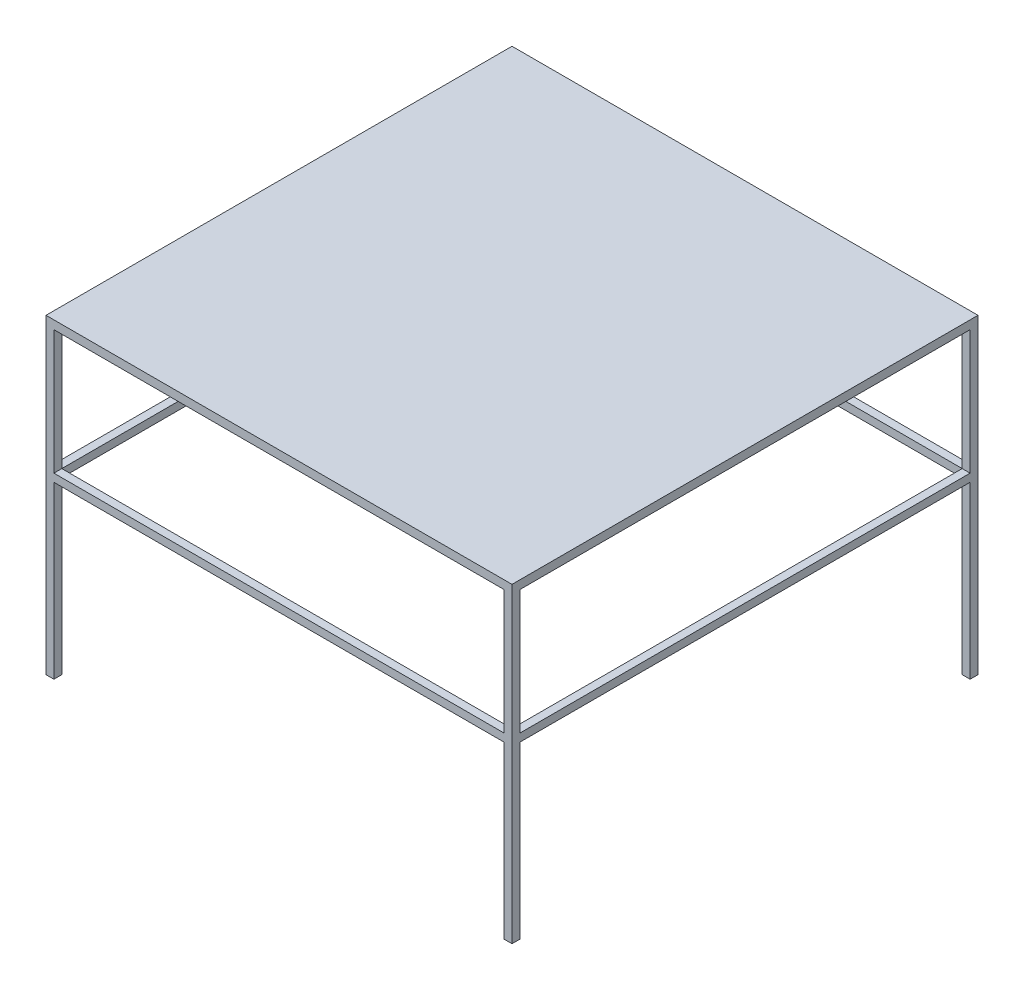
ISO-10303-21;
HEADER;
FILE_DESCRIPTION(('STEP AP214'),'2;1');
FILE_NAME('part.step','',(''),(''),'','','');
FILE_SCHEMA(('AUTOMOTIVE_DESIGN { 1 0 10303 214 1 1 1 1 }'));
ENDSEC;
DATA;
#1=APPLICATION_CONTEXT('core data for automotive mechanical design processes');
#2=APPLICATION_PROTOCOL_DEFINITION('international standard','automotive_design',2000,#1);
#3=PRODUCT_CONTEXT('',#1,'mechanical');
#4=PRODUCT('Part','Part','',(#3));
#5=PRODUCT_RELATED_PRODUCT_CATEGORY('part','',(#4));
#6=PRODUCT_DEFINITION_FORMATION('','',#4);
#7=PRODUCT_DEFINITION_CONTEXT('part definition',#1,'design');
#8=PRODUCT_DEFINITION('design','',#6,#7);
#9=PRODUCT_DEFINITION_SHAPE('','',#8);
#10=(LENGTH_UNIT() NAMED_UNIT(*) SI_UNIT(.MILLI.,.METRE.));
#11=(NAMED_UNIT(*) PLANE_ANGLE_UNIT() SI_UNIT($,.RADIAN.));
#12=(NAMED_UNIT(*) SI_UNIT($,.STERADIAN.) SOLID_ANGLE_UNIT());
#13=UNCERTAINTY_MEASURE_WITH_UNIT(LENGTH_MEASURE(1.E-05),#10,'distance_accuracy_value','');
#14=(GEOMETRIC_REPRESENTATION_CONTEXT(3) GLOBAL_UNCERTAINTY_ASSIGNED_CONTEXT((#13)) GLOBAL_UNIT_ASSIGNED_CONTEXT((#10,
#11,#12)) REPRESENTATION_CONTEXT('',''));
#15=CARTESIAN_POINT('',(0.,0.,0.));
#16=DIRECTION('',(0.,0.,1.));
#17=DIRECTION('',(1.,0.,0.));
#18=AXIS2_PLACEMENT_3D('',#15,#16,#17);
#19=CARTESIAN_POINT('',(0.,1000.,25.4));
#20=DIRECTION('',(0.,0.,-1.));
#21=DIRECTION('',(-1.,0.,0.));
#22=AXIS2_PLACEMENT_3D('',#19,#20,#21);
#23=PLANE('',#22);
#24=DIRECTION('',(0.,-1.,0.));
#25=VECTOR('',#24,1.);
#26=CARTESIAN_POINT('',(0.,1000.,25.4));
#27=LINE('',#26,#25);
#28=CARTESIAN_POINT('',(0.,974.6,25.4));
#29=VERTEX_POINT('',#28);
#30=CARTESIAN_POINT('',(0.,574.6,25.4));
#31=VERTEX_POINT('',#30);
#32=EDGE_CURVE('E11',#29,#31,#27,.T.);
#33=ORIENTED_EDGE('',*,*,#32,.T.);
#34=DIRECTION('',(-1.,0.,0.));
#35=VECTOR('',#34,1.);
#36=CARTESIAN_POINT('',(25.4,574.6,25.4000000000002));
#37=LINE('',#36,#35);
#38=CARTESIAN_POINT('',(25.4,574.6,25.4));
#39=VERTEX_POINT('',#38);
#40=EDGE_CURVE('E277',#39,#31,#37,.T.);
#41=ORIENTED_EDGE('',*,*,#40,.F.);
#42=DIRECTION('',(0.,-1.,0.));
#43=VECTOR('',#42,1.);
#44=CARTESIAN_POINT('',(25.4,1000.,25.4));
#45=LINE('',#44,#43);
#46=CARTESIAN_POINT('',(25.4,974.6,25.4));
#47=VERTEX_POINT('',#46);
#48=EDGE_CURVE('E512',#47,#39,#45,.T.);
#49=ORIENTED_EDGE('',*,*,#48,.F.);
#50=DIRECTION('',(-1.,0.,0.));
#51=VECTOR('',#50,1.);
#52=CARTESIAN_POINT('',(25.4,974.6,25.4));
#53=LINE('',#52,#51);
#54=EDGE_CURVE('E299',#47,#29,#53,.T.);
#55=ORIENTED_EDGE('',*,*,#54,.T.);
#56=EDGE_LOOP('',(#33,#41,#49,#55));
#57=FACE_BOUND('',#56,.T.);
#58=ADVANCED_FACE('F33',(#57),#23,.F.);
#59=DIRECTION('',(0.,-1.,0.));
#60=VECTOR('',#59,1.);
#61=CARTESIAN_POINT('',(25.4,574.6,25.4000000000002));
#62=LINE('',#61,#60);
#63=CARTESIAN_POINT('',(25.4,549.2,25.4));
#64=VERTEX_POINT('',#63);
#65=EDGE_CURVE('E261',#39,#64,#62,.T.);
#66=ORIENTED_EDGE('',*,*,#65,.T.);
#67=DIRECTION('',(-1.,0.,0.));
#68=VECTOR('',#67,1.);
#69=CARTESIAN_POINT('',(1474.6,549.2,25.4));
#70=LINE('',#69,#68);
#71=CARTESIAN_POINT('',(1474.6,549.2,25.4));
#72=VERTEX_POINT('',#71);
#73=EDGE_CURVE('E308',#72,#64,#70,.T.);
#74=ORIENTED_EDGE('',*,*,#73,.F.);
#75=DIRECTION('',(0.,-1.,0.));
#76=VECTOR('',#75,1.);
#77=CARTESIAN_POINT('',(1474.6,574.6,25.4));
#78=LINE('',#77,#76);
#79=CARTESIAN_POINT('',(1474.6,574.6,25.4));
#80=VERTEX_POINT('',#79);
#81=EDGE_CURVE('E306',#80,#72,#78,.T.);
#82=ORIENTED_EDGE('',*,*,#81,.F.);
#83=DIRECTION('',(1.,0.,0.));
#84=VECTOR('',#83,1.);
#85=CARTESIAN_POINT('',(1474.6,574.6,25.4));
#86=LINE('',#85,#84);
#87=EDGE_CURVE('E312',#39,#80,#86,.T.);
#88=ORIENTED_EDGE('',*,*,#87,.F.);
#89=EDGE_LOOP('',(#66,#74,#82,#88));
#90=FACE_BOUND('',#89,.T.);
#91=ADVANCED_FACE('F571',(#90),#23,.F.);
#92=CARTESIAN_POINT('',(0.,1000.,1474.6));
#93=DIRECTION('',(0.,0.,1.));
#94=DIRECTION('',(1.,0.,0.));
#95=AXIS2_PLACEMENT_3D('',#92,#93,#94);
#96=PLANE('',#95);
#97=DIRECTION('',(0.,-1.,0.));
#98=VECTOR('',#97,1.);
#99=CARTESIAN_POINT('',(25.4,1000.,1474.6));
#100=LINE('',#99,#98);
#101=CARTESIAN_POINT('',(25.4000000000002,974.6,1474.6));
#102=VERTEX_POINT('',#101);
#103=CARTESIAN_POINT('',(25.4000000000002,574.6,1474.6));
#104=VERTEX_POINT('',#103);
#105=EDGE_CURVE('E435',#102,#104,#100,.T.);
#106=ORIENTED_EDGE('',*,*,#105,.T.);
#107=DIRECTION('',(-1.,0.,0.));
#108=VECTOR('',#107,1.);
#109=CARTESIAN_POINT('',(25.4000000000002,574.6,1474.6));
#110=LINE('',#109,#108);
#111=CARTESIAN_POINT('',(1.80586417002269E-13,574.6,1474.6));
#112=VERTEX_POINT('',#111);
#113=EDGE_CURVE('E280',#104,#112,#110,.T.);
#114=ORIENTED_EDGE('',*,*,#113,.T.);
#115=DIRECTION('',(0.,-1.,0.));
#116=VECTOR('',#115,1.);
#117=CARTESIAN_POINT('',(0.,1000.,1474.6));
#118=LINE('',#117,#116);
#119=CARTESIAN_POINT('',(0.,974.6,1474.6));
#120=VERTEX_POINT('',#119);
#121=EDGE_CURVE('E431',#120,#112,#118,.T.);
#122=ORIENTED_EDGE('',*,*,#121,.F.);
#123=DIRECTION('',(-1.,0.,0.));
#124=VECTOR('',#123,1.);
#125=CARTESIAN_POINT('',(25.4000000000002,974.6,1474.6));
#126=LINE('',#125,#124);
#127=EDGE_CURVE('E301',#102,#120,#126,.T.);
#128=ORIENTED_EDGE('',*,*,#127,.F.);
#129=EDGE_LOOP('',(#106,#114,#122,#128));
#130=FACE_BOUND('',#129,.T.);
#131=ADVANCED_FACE('F581',(#130),#96,.F.);
#132=DIRECTION('',(0.,1.,0.));
#133=VECTOR('',#132,1.);
#134=CARTESIAN_POINT('',(25.4000000000002,574.6,1474.6));
#135=LINE('',#134,#133);
#136=CARTESIAN_POINT('',(25.4000000000002,549.2,1474.6));
#137=VERTEX_POINT('',#136);
#138=EDGE_CURVE('E267',#137,#104,#135,.T.);
#139=ORIENTED_EDGE('',*,*,#138,.T.);
#140=DIRECTION('',(1.,0.,0.));
#141=VECTOR('',#140,1.);
#142=CARTESIAN_POINT('',(25.4,574.6,1474.6));
#143=LINE('',#142,#141);
#144=CARTESIAN_POINT('',(1474.6,574.6,1474.6));
#145=VERTEX_POINT('',#144);
#146=EDGE_CURVE('E356',#104,#145,#143,.T.);
#147=ORIENTED_EDGE('',*,*,#146,.T.);
#148=DIRECTION('',(0.,-1.,0.));
#149=VECTOR('',#148,1.);
#150=CARTESIAN_POINT('',(1474.6,574.6,1474.6));
#151=LINE('',#150,#149);
#152=CARTESIAN_POINT('',(1474.6,549.2,1474.6));
#153=VERTEX_POINT('',#152);
#154=EDGE_CURVE('E331',#145,#153,#151,.T.);
#155=ORIENTED_EDGE('',*,*,#154,.T.);
#156=DIRECTION('',(-1.,0.,0.));
#157=VECTOR('',#156,1.);
#158=CARTESIAN_POINT('',(25.4,549.2,1474.6));
#159=LINE('',#158,#157);
#160=EDGE_CURVE('E359',#153,#137,#159,.T.);
#161=ORIENTED_EDGE('',*,*,#160,.T.);
#162=EDGE_LOOP('',(#139,#147,#155,#161));
#163=FACE_BOUND('',#162,.T.);
#164=ADVANCED_FACE('F641',(#163),#96,.F.);
#165=DIRECTION('',(0.,-1.,0.));
#166=VECTOR('',#165,1.);
#167=CARTESIAN_POINT('',(25.4,1000.,25.4));
#168=LINE('',#167,#166);
#169=CARTESIAN_POINT('',(25.4,1000.,25.4));
#170=VERTEX_POINT('',#169);
#171=EDGE_CURVE('E287',#170,#47,#168,.T.);
#172=ORIENTED_EDGE('',*,*,#171,.T.);
#173=DIRECTION('',(-1.,0.,0.));
#174=VECTOR('',#173,1.);
#175=CARTESIAN_POINT('',(1474.6,974.6,25.4));
#176=LINE('',#175,#174);
#177=CARTESIAN_POINT('',(1474.6,974.6,25.4));
#178=VERTEX_POINT('',#177);
#179=EDGE_CURVE('E482',#178,#47,#176,.T.);
#180=ORIENTED_EDGE('',*,*,#179,.F.);
#181=DIRECTION('',(0.,-1.,0.));
#182=VECTOR('',#181,1.);
#183=CARTESIAN_POINT('',(1474.6,1000.,25.4));
#184=LINE('',#183,#182);
#185=CARTESIAN_POINT('',(1474.6,1000.,25.4));
#186=VERTEX_POINT('',#185);
#187=EDGE_CURVE('E479',#186,#178,#184,.T.);
#188=ORIENTED_EDGE('',*,*,#187,.F.);
#189=DIRECTION('',(1.,0.,0.));
#190=VECTOR('',#189,1.);
#191=CARTESIAN_POINT('',(0.,1000.,25.4));
#192=LINE('',#191,#190);
#193=EDGE_CURVE('E494',#170,#186,#192,.T.);
#194=ORIENTED_EDGE('',*,*,#193,.F.);
#195=EDGE_LOOP('',(#172,#180,#188,#194));
#196=FACE_BOUND('',#195,.T.);
#197=ADVANCED_FACE('F640',(#196),#23,.F.);
#198=DIRECTION('',(0.,1.,0.));
#199=VECTOR('',#198,1.);
#200=CARTESIAN_POINT('',(25.4000000000002,1000.,1474.6));
#201=LINE('',#200,#199);
#202=CARTESIAN_POINT('',(25.4000000000002,1000.,1474.6));
#203=VERTEX_POINT('',#202);
#204=EDGE_CURVE('E293',#102,#203,#201,.T.);
#205=ORIENTED_EDGE('',*,*,#204,.T.);
#206=DIRECTION('',(-1.,0.,0.));
#207=VECTOR('',#206,1.);
#208=CARTESIAN_POINT('',(0.,1000.,1474.6));
#209=LINE('',#208,#207);
#210=CARTESIAN_POINT('',(1474.6,1000.,1474.6));
#211=VERTEX_POINT('',#210);
#212=EDGE_CURVE('E414',#211,#203,#209,.T.);
#213=ORIENTED_EDGE('',*,*,#212,.F.);
#214=DIRECTION('',(0.,-1.,0.));
#215=VECTOR('',#214,1.);
#216=CARTESIAN_POINT('',(1474.6,1000.,1474.6));
#217=LINE('',#216,#215);
#218=CARTESIAN_POINT('',(1474.6,974.6,1474.6));
#219=VERTEX_POINT('',#218);
#220=EDGE_CURVE('E443',#211,#219,#217,.T.);
#221=ORIENTED_EDGE('',*,*,#220,.T.);
#222=DIRECTION('',(-1.,0.,0.));
#223=VECTOR('',#222,1.);
#224=CARTESIAN_POINT('',(25.4,974.6,1474.6));
#225=LINE('',#224,#223);
#226=EDGE_CURVE('E408',#219,#102,#225,.T.);
#227=ORIENTED_EDGE('',*,*,#226,.T.);
#228=EDGE_LOOP('',(#205,#213,#221,#227));
#229=FACE_BOUND('',#228,.T.);
#230=ADVANCED_FACE('F590',(#229),#96,.F.);
#231=CARTESIAN_POINT('',(25.4,1000.,0.));
#232=DIRECTION('',(-1.,0.,0.));
#233=DIRECTION('',(0.,0.,1.));
#234=AXIS2_PLACEMENT_3D('',#231,#232,#233);
#235=PLANE('',#234);
#236=ORIENTED_EDGE('',*,*,#48,.T.);
#237=DIRECTION('',(0.,0.,-1.));
#238=VECTOR('',#237,1.);
#239=CARTESIAN_POINT('',(25.4,574.6,25.4));
#240=LINE('',#239,#238);
#241=CARTESIAN_POINT('',(25.4,574.6,0.));
#242=VERTEX_POINT('',#241);
#243=EDGE_CURVE('E323',#39,#242,#240,.T.);
#244=ORIENTED_EDGE('',*,*,#243,.T.);
#245=DIRECTION('',(0.,-1.,0.));
#246=VECTOR('',#245,1.);
#247=CARTESIAN_POINT('',(25.4,1000.,0.));
#248=LINE('',#247,#246);
#249=CARTESIAN_POINT('',(25.4,974.6,0.));
#250=VERTEX_POINT('',#249);
#251=EDGE_CURVE('E509',#250,#242,#248,.T.);
#252=ORIENTED_EDGE('',*,*,#251,.F.);
#253=DIRECTION('',(0.,0.,-1.));
#254=VECTOR('',#253,1.);
#255=CARTESIAN_POINT('',(25.4,974.6,25.4));
#256=LINE('',#255,#254);
#257=EDGE_CURVE('E488',#47,#250,#256,.T.);
#258=ORIENTED_EDGE('',*,*,#257,.F.);
#259=EDGE_LOOP('',(#236,#244,#252,#258));
#260=FACE_BOUND('',#259,.T.);
#261=ADVANCED_FACE('F639',(#260),#235,.F.);
#262=CARTESIAN_POINT('',(1474.6,1000.,0.));
#263=DIRECTION('',(1.,0.,0.));
#264=DIRECTION('',(0.,0.,-1.));
#265=AXIS2_PLACEMENT_3D('',#262,#263,#264);
#266=PLANE('',#265);
#267=DIRECTION('',(0.,-1.,0.));
#268=VECTOR('',#267,1.);
#269=CARTESIAN_POINT('',(1474.6,1000.,0.));
#270=LINE('',#269,#268);
#271=CARTESIAN_POINT('',(1474.6,974.6,0.));
#272=VERTEX_POINT('',#271);
#273=CARTESIAN_POINT('',(1474.6,574.6,0.));
#274=VERTEX_POINT('',#273);
#275=EDGE_CURVE('E476',#272,#274,#270,.T.);
#276=ORIENTED_EDGE('',*,*,#275,.T.);
#277=DIRECTION('',(0.,0.,-1.));
#278=VECTOR('',#277,1.);
#279=CARTESIAN_POINT('',(1474.6,574.6,25.4));
#280=LINE('',#279,#278);
#281=EDGE_CURVE('E319',#80,#274,#280,.T.);
#282=ORIENTED_EDGE('',*,*,#281,.F.);
#283=DIRECTION('',(0.,-1.,0.));
#284=VECTOR('',#283,1.);
#285=CARTESIAN_POINT('',(1474.6,1000.,25.4));
#286=LINE('',#285,#284);
#287=EDGE_CURVE('E472',#178,#80,#286,.T.);
#288=ORIENTED_EDGE('',*,*,#287,.F.);
#289=DIRECTION('',(0.,0.,-1.));
#290=VECTOR('',#289,1.);
#291=CARTESIAN_POINT('',(1474.6,974.6,25.4));
#292=LINE('',#291,#290);
#293=EDGE_CURVE('E485',#178,#272,#292,.T.);
#294=ORIENTED_EDGE('',*,*,#293,.T.);
#295=EDGE_LOOP('',(#276,#282,#288,#294));
#296=FACE_BOUND('',#295,.T.);
#297=ADVANCED_FACE('F667',(#296),#266,.F.);
#298=ORIENTED_EDGE('',*,*,#81,.T.);
#299=DIRECTION('',(0.,0.,-1.));
#300=VECTOR('',#299,1.);
#301=CARTESIAN_POINT('',(1474.6,549.2,1474.6));
#302=LINE('',#301,#300);
#303=EDGE_CURVE('E333',#153,#72,#302,.T.);
#304=ORIENTED_EDGE('',*,*,#303,.F.);
#305=ORIENTED_EDGE('',*,*,#154,.F.);
#306=DIRECTION('',(0.,0.,1.));
#307=VECTOR('',#306,1.);
#308=CARTESIAN_POINT('',(1474.6,574.6,1474.6));
#309=LINE('',#308,#307);
#310=EDGE_CURVE('E337',#80,#145,#309,.T.);
#311=ORIENTED_EDGE('',*,*,#310,.F.);
#312=EDGE_LOOP('',(#298,#304,#305,#311));
#313=FACE_BOUND('',#312,.T.);
#314=ADVANCED_FACE('F610',(#313),#266,.F.);
#315=CARTESIAN_POINT('',(25.4,549.2,0.));
#316=VERTEX_POINT('',#315);
#317=CARTESIAN_POINT('',(25.4,0.,0.));
#318=VERTEX_POINT('',#317);
#319=EDGE_CURVE('E508',#316,#318,#248,.T.);
#320=ORIENTED_EDGE('',*,*,#319,.F.);
#321=DIRECTION('',(0.,0.,-1.));
#322=VECTOR('',#321,1.);
#323=CARTESIAN_POINT('',(25.4,549.2,25.4));
#324=LINE('',#323,#322);
#325=EDGE_CURVE('E326',#64,#316,#324,.T.);
#326=ORIENTED_EDGE('',*,*,#325,.F.);
#327=CARTESIAN_POINT('',(25.4,0.,25.4));
#328=VERTEX_POINT('',#327);
#329=EDGE_CURVE('E511',#64,#328,#45,.T.);
#330=ORIENTED_EDGE('',*,*,#329,.T.);
#331=DIRECTION('',(0.,0.,-1.));
#332=VECTOR('',#331,1.);
#333=CARTESIAN_POINT('',(25.4,0.,0.));
#334=LINE('',#333,#332);
#335=EDGE_CURVE('E503',#328,#318,#334,.T.);
#336=ORIENTED_EDGE('',*,*,#335,.T.);
#337=EDGE_LOOP('',(#320,#326,#330,#336));
#338=FACE_BOUND('',#337,.T.);
#339=ADVANCED_FACE('F522',(#338),#235,.F.);
#340=CARTESIAN_POINT('',(0.,1000.,0.));
#341=DIRECTION('',(1.,0.,0.));
#342=DIRECTION('',(0.,0.,-1.));
#343=AXIS2_PLACEMENT_3D('',#340,#341,#342);
#344=PLANE('',#343);
#345=CARTESIAN_POINT('',(0.,549.2,25.4000000000002));
#346=VERTEX_POINT('',#345);
#347=CARTESIAN_POINT('',(0.,0.,25.4));
#348=VERTEX_POINT('',#347);
#349=EDGE_CURVE('E41',#346,#348,#27,.T.);
#350=ORIENTED_EDGE('',*,*,#349,.F.);
#351=DIRECTION('',(0.,0.,1.));
#352=VECTOR('',#351,1.);
#353=CARTESIAN_POINT('',(0.,549.2,25.4000000000002));
#354=LINE('',#353,#352);
#355=CARTESIAN_POINT('',(0.,549.2,1474.6));
#356=VERTEX_POINT('',#355);
#357=EDGE_CURVE('E54',#346,#356,#354,.T.);
#358=ORIENTED_EDGE('',*,*,#357,.T.);
#359=CARTESIAN_POINT('',(0.,0.,1474.6));
#360=VERTEX_POINT('',#359);
#361=EDGE_CURVE('E430',#356,#360,#118,.T.);
#362=ORIENTED_EDGE('',*,*,#361,.T.);
#363=DIRECTION('',(0.,0.,1.));
#364=VECTOR('',#363,1.);
#365=CARTESIAN_POINT('',(0.,0.,1500.));
#366=LINE('',#365,#364);
#367=CARTESIAN_POINT('',(0.,0.,1500.));
#368=VERTEX_POINT('',#367);
#369=EDGE_CURVE('E418',#360,#368,#366,.T.);
#370=ORIENTED_EDGE('',*,*,#369,.T.);
#371=DIRECTION('',(0.,-1.,0.));
#372=VECTOR('',#371,1.);
#373=CARTESIAN_POINT('',(0.,1000.,1500.));
#374=LINE('',#373,#372);
#375=CARTESIAN_POINT('',(0.,1001.9,1500.));
#376=VERTEX_POINT('',#375);
#377=EDGE_CURVE('E417',#376,#368,#374,.T.);
#378=ORIENTED_EDGE('',*,*,#377,.F.);
#379=DIRECTION('',(0.,0.,1.));
#380=VECTOR('',#379,1.);
#381=CARTESIAN_POINT('',(0.,1001.9,0.));
#382=LINE('',#381,#380);
#383=CARTESIAN_POINT('',(0.,1001.9,0.));
#384=VERTEX_POINT('',#383);
#385=EDGE_CURVE('E251',#384,#376,#382,.T.);
#386=ORIENTED_EDGE('',*,*,#385,.F.);
#387=DIRECTION('',(0.,-1.,0.));
#388=VECTOR('',#387,1.);
#389=CARTESIAN_POINT('',(0.,1000.,0.));
#390=LINE('',#389,#388);
#391=CARTESIAN_POINT('',(0.,0.,0.));
#392=VERTEX_POINT('',#391);
#393=EDGE_CURVE('E247',#384,#392,#390,.T.);
#394=ORIENTED_EDGE('',*,*,#393,.T.);
#395=DIRECTION('',(0.,0.,1.));
#396=VECTOR('',#395,1.);
#397=CARTESIAN_POINT('',(0.,0.,0.));
#398=LINE('',#397,#396);
#399=EDGE_CURVE('E491',#392,#348,#398,.T.);
#400=ORIENTED_EDGE('',*,*,#399,.T.);
#401=EDGE_LOOP('',(#350,#358,#362,#370,#378,#386,#394,#400));
#402=FACE_BOUND('',#401,.T.);
#403=DIRECTION('',(0.,0.,-1.));
#404=VECTOR('',#403,1.);
#405=CARTESIAN_POINT('',(0.,574.6,25.4000000000002));
#406=LINE('',#405,#404);
#407=EDGE_CURVE('E264',#112,#31,#406,.T.);
#408=ORIENTED_EDGE('',*,*,#407,.T.);
#409=ORIENTED_EDGE('',*,*,#32,.F.);
#410=DIRECTION('',(0.,0.,1.));
#411=VECTOR('',#410,1.);
#412=CARTESIAN_POINT('',(0.,974.6,25.4));
#413=LINE('',#412,#411);
#414=EDGE_CURVE('E279',#29,#120,#413,.T.);
#415=ORIENTED_EDGE('',*,*,#414,.T.);
#416=ORIENTED_EDGE('',*,*,#121,.T.);
#417=EDGE_LOOP('',(#408,#409,#415,#416));
#418=FACE_BOUND('',#417,.T.);
#419=ADVANCED_FACE('F35',(#402,#418),#344,.F.);
#420=ORIENTED_EDGE('',*,*,#329,.F.);
#421=DIRECTION('',(-1.,0.,0.));
#422=VECTOR('',#421,1.);
#423=CARTESIAN_POINT('',(25.4,549.2,25.4000000000002));
#424=LINE('',#423,#422);
#425=EDGE_CURVE('E273',#64,#346,#424,.T.);
#426=ORIENTED_EDGE('',*,*,#425,.T.);
#427=ORIENTED_EDGE('',*,*,#349,.T.);
#428=DIRECTION('',(1.,0.,0.));
#429=VECTOR('',#428,1.);
#430=CARTESIAN_POINT('',(0.,0.,25.4));
#431=LINE('',#430,#429);
#432=EDGE_CURVE('E500',#348,#328,#431,.T.);
#433=ORIENTED_EDGE('',*,*,#432,.T.);
#434=EDGE_LOOP('',(#420,#426,#427,#433));
#435=FACE_BOUND('',#434,.T.);
#436=ADVANCED_FACE('F528',(#435),#23,.F.);
#437=CARTESIAN_POINT('',(0.,1000.,0.));
#438=DIRECTION('',(0.,0.,1.));
#439=DIRECTION('',(1.,0.,0.));
#440=AXIS2_PLACEMENT_3D('',#437,#438,#439);
#441=PLANE('',#440);
#442=ORIENTED_EDGE('',*,*,#251,.T.);
#443=DIRECTION('',(1.,0.,0.));
#444=VECTOR('',#443,1.);
#445=CARTESIAN_POINT('',(1474.6,574.6,0.));
#446=LINE('',#445,#444);
#447=EDGE_CURVE('E309',#242,#274,#446,.T.);
#448=ORIENTED_EDGE('',*,*,#447,.T.);
#449=ORIENTED_EDGE('',*,*,#275,.F.);
#450=DIRECTION('',(-1.,0.,0.));
#451=VECTOR('',#450,1.);
#452=CARTESIAN_POINT('',(1474.6,974.6,0.));
#453=LINE('',#452,#451);
#454=EDGE_CURVE('E478',#272,#250,#453,.T.);
#455=ORIENTED_EDGE('',*,*,#454,.T.);
#456=EDGE_LOOP('',(#442,#448,#449,#455));
#457=FACE_BOUND('',#456,.T.);
#458=DIRECTION('',(-1.,0.,0.));
#459=VECTOR('',#458,1.);
#460=CARTESIAN_POINT('',(0.,0.,0.));
#461=LINE('',#460,#459);
#462=EDGE_CURVE('E497',#318,#392,#461,.T.);
#463=ORIENTED_EDGE('',*,*,#462,.T.);
#464=ORIENTED_EDGE('',*,*,#393,.F.);
#465=DIRECTION('',(-1.,0.,0.));
#466=VECTOR('',#465,1.);
#467=CARTESIAN_POINT('',(1500.,1001.9,0.));
#468=LINE('',#467,#466);
#469=CARTESIAN_POINT('',(1500.,1001.9,0.));
#470=VERTEX_POINT('',#469);
#471=EDGE_CURVE('E244',#470,#384,#468,.T.);
#472=ORIENTED_EDGE('',*,*,#471,.F.);
#473=DIRECTION('',(0.,-1.,0.));
#474=VECTOR('',#473,1.);
#475=CARTESIAN_POINT('',(1500.,1000.,0.));
#476=LINE('',#475,#474);
#477=CARTESIAN_POINT('',(1500.,0.,0.));
#478=VERTEX_POINT('',#477);
#479=EDGE_CURVE('E229',#470,#478,#476,.T.);
#480=ORIENTED_EDGE('',*,*,#479,.T.);
#481=DIRECTION('',(-1.,0.,0.));
#482=VECTOR('',#481,1.);
#483=CARTESIAN_POINT('',(1500.,0.,0.));
#484=LINE('',#483,#482);
#485=CARTESIAN_POINT('',(1474.6,0.,0.));
#486=VERTEX_POINT('',#485);
#487=EDGE_CURVE('E455',#478,#486,#484,.T.);
#488=ORIENTED_EDGE('',*,*,#487,.T.);
#489=CARTESIAN_POINT('',(1474.6,549.2,0.));
#490=VERTEX_POINT('',#489);
#491=EDGE_CURVE('E475',#490,#486,#270,.T.);
#492=ORIENTED_EDGE('',*,*,#491,.F.);
#493=DIRECTION('',(-1.,0.,0.));
#494=VECTOR('',#493,1.);
#495=CARTESIAN_POINT('',(1474.6,549.2,0.));
#496=LINE('',#495,#494);
#497=EDGE_CURVE('E304',#490,#316,#496,.T.);
#498=ORIENTED_EDGE('',*,*,#497,.T.);
#499=ORIENTED_EDGE('',*,*,#319,.T.);
#500=EDGE_LOOP('',(#463,#464,#472,#480,#488,#492,#498,#499));
#501=FACE_BOUND('',#500,.T.);
#502=ADVANCED_FACE('F245',(#457,#501),#441,.F.);
#503=CARTESIAN_POINT('',(0.,0.,0.));
#504=DIRECTION('',(0.,1.,0.));
#505=DIRECTION('',(0.,0.,1.));
#506=AXIS2_PLACEMENT_3D('',#503,#504,#505);
#507=PLANE('',#506);
#508=ORIENTED_EDGE('',*,*,#399,.F.);
#509=ORIENTED_EDGE('',*,*,#462,.F.);
#510=ORIENTED_EDGE('',*,*,#335,.F.);
#511=ORIENTED_EDGE('',*,*,#432,.F.);
#512=EDGE_LOOP('',(#508,#509,#510,#511));
#513=FACE_BOUND('',#512,.T.);
#514=ADVANCED_FACE('F531',(#513),#507,.F.);
#515=CARTESIAN_POINT('',(1474.6,974.6,25.4));
#516=DIRECTION('',(0.,-1.,0.));
#517=DIRECTION('',(0.,0.,-1.));
#518=AXIS2_PLACEMENT_3D('',#515,#516,#517);
#519=PLANE('',#518);
#520=ORIENTED_EDGE('',*,*,#454,.F.);
#521=ORIENTED_EDGE('',*,*,#293,.F.);
#522=ORIENTED_EDGE('',*,*,#179,.T.);
#523=ORIENTED_EDGE('',*,*,#257,.T.);
#524=EDGE_LOOP('',(#520,#521,#522,#523));
#525=FACE_BOUND('',#524,.T.);
#526=ADVANCED_FACE('F664',(#525),#519,.T.);
#527=DIRECTION('',(0.,0.,1.));
#528=VECTOR('',#527,1.);
#529=CARTESIAN_POINT('',(1474.6,1000.,0.));
#530=LINE('',#529,#528);
#531=EDGE_CURVE('E241',#186,#211,#530,.T.);
#532=ORIENTED_EDGE('',*,*,#531,.F.);
#533=ORIENTED_EDGE('',*,*,#187,.T.);
#534=DIRECTION('',(0.,0.,-1.));
#535=VECTOR('',#534,1.);
#536=CARTESIAN_POINT('',(1474.6,974.6,1474.6));
#537=LINE('',#536,#535);
#538=EDGE_CURVE('E446',#219,#178,#537,.T.);
#539=ORIENTED_EDGE('',*,*,#538,.F.);
#540=ORIENTED_EDGE('',*,*,#220,.F.);
#541=EDGE_LOOP('',(#532,#533,#539,#540));
#542=FACE_BOUND('',#541,.T.);
#543=ADVANCED_FACE('F634',(#542),#266,.F.);
#544=CARTESIAN_POINT('',(1500.,1000.,25.4));
#545=DIRECTION('',(0.,0.,-1.));
#546=DIRECTION('',(-1.,0.,0.));
#547=AXIS2_PLACEMENT_3D('',#544,#545,#546);
#548=PLANE('',#547);
#549=ORIENTED_EDGE('',*,*,#287,.T.);
#550=DIRECTION('',(1.,0.,0.));
#551=VECTOR('',#550,1.);
#552=CARTESIAN_POINT('',(1474.6,574.6,25.4));
#553=LINE('',#552,#551);
#554=CARTESIAN_POINT('',(1500.,574.6,25.4));
#555=VERTEX_POINT('',#554);
#556=EDGE_CURVE('E348',#80,#555,#553,.T.);
#557=ORIENTED_EDGE('',*,*,#556,.T.);
#558=DIRECTION('',(0.,-1.,0.));
#559=VECTOR('',#558,1.);
#560=CARTESIAN_POINT('',(1500.,1000.,25.4));
#561=LINE('',#560,#559);
#562=CARTESIAN_POINT('',(1500.,974.6,25.4));
#563=VERTEX_POINT('',#562);
#564=EDGE_CURVE('E468',#563,#555,#561,.T.);
#565=ORIENTED_EDGE('',*,*,#564,.F.);
#566=DIRECTION('',(1.,0.,0.));
#567=VECTOR('',#566,1.);
#568=CARTESIAN_POINT('',(1474.6,974.6,25.4));
#569=LINE('',#568,#567);
#570=EDGE_CURVE('E452',#178,#563,#569,.T.);
#571=ORIENTED_EDGE('',*,*,#570,.F.);
#572=EDGE_LOOP('',(#549,#557,#565,#571));
#573=FACE_BOUND('',#572,.T.);
#574=ADVANCED_FACE('F616',(#573),#548,.F.);
#575=DIRECTION('',(0.,-1.,0.));
#576=VECTOR('',#575,1.);
#577=CARTESIAN_POINT('',(1500.,1000.,1474.6));
#578=LINE('',#577,#576);
#579=CARTESIAN_POINT('',(1500.,974.6,1474.6));
#580=VERTEX_POINT('',#579);
#581=CARTESIAN_POINT('',(1500.,574.6,1474.6));
#582=VERTEX_POINT('',#581);
#583=EDGE_CURVE('E399',#580,#582,#578,.T.);
#584=ORIENTED_EDGE('',*,*,#583,.T.);
#585=DIRECTION('',(1.,0.,0.));
#586=VECTOR('',#585,1.);
#587=CARTESIAN_POINT('',(1474.6,574.6,1474.6));
#588=LINE('',#587,#586);
#589=EDGE_CURVE('E344',#145,#582,#588,.T.);
#590=ORIENTED_EDGE('',*,*,#589,.F.);
#591=DIRECTION('',(0.,-1.,0.));
#592=VECTOR('',#591,1.);
#593=CARTESIAN_POINT('',(1474.6,1000.,1474.6));
#594=LINE('',#593,#592);
#595=EDGE_CURVE('E395',#219,#145,#594,.T.);
#596=ORIENTED_EDGE('',*,*,#595,.F.);
#597=DIRECTION('',(1.,0.,0.));
#598=VECTOR('',#597,1.);
#599=CARTESIAN_POINT('',(1474.6,974.6,1474.6));
#600=LINE('',#599,#598);
#601=EDGE_CURVE('E449',#219,#580,#600,.T.);
#602=ORIENTED_EDGE('',*,*,#601,.T.);
#603=EDGE_LOOP('',(#584,#590,#596,#602));
#604=FACE_BOUND('',#603,.T.);
#605=ADVANCED_FACE('F625',(#604),#96,.F.);
#606=ORIENTED_EDGE('',*,*,#361,.F.);
#607=DIRECTION('',(-1.,0.,0.));
#608=VECTOR('',#607,1.);
#609=CARTESIAN_POINT('',(25.4000000000002,549.2,1474.6));
#610=LINE('',#609,#608);
#611=EDGE_CURVE('E283',#137,#356,#610,.T.);
#612=ORIENTED_EDGE('',*,*,#611,.F.);
#613=CARTESIAN_POINT('',(25.4,0.,1474.6));
#614=VERTEX_POINT('',#613);
#615=EDGE_CURVE('E434',#137,#614,#100,.T.);
#616=ORIENTED_EDGE('',*,*,#615,.T.);
#617=DIRECTION('',(-1.,0.,0.));
#618=VECTOR('',#617,1.);
#619=CARTESIAN_POINT('',(0.,0.,1474.6));
#620=LINE('',#619,#618);
#621=EDGE_CURVE('E424',#614,#360,#620,.T.);
#622=ORIENTED_EDGE('',*,*,#621,.T.);
#623=EDGE_LOOP('',(#606,#612,#616,#622));
#624=FACE_BOUND('',#623,.T.);
#625=ADVANCED_FACE('F627',(#624),#96,.F.);
#626=CARTESIAN_POINT('',(1500.,549.2,25.4));
#627=VERTEX_POINT('',#626);
#628=CARTESIAN_POINT('',(1500.,0.,25.4));
#629=VERTEX_POINT('',#628);
#630=EDGE_CURVE('E240',#627,#629,#561,.T.);
#631=ORIENTED_EDGE('',*,*,#630,.F.);
#632=DIRECTION('',(1.,0.,0.));
#633=VECTOR('',#632,1.);
#634=CARTESIAN_POINT('',(1474.6,549.2,25.4));
#635=LINE('',#634,#633);
#636=EDGE_CURVE('E351',#72,#627,#635,.T.);
#637=ORIENTED_EDGE('',*,*,#636,.F.);
#638=CARTESIAN_POINT('',(1474.6,0.,25.4));
#639=VERTEX_POINT('',#638);
#640=EDGE_CURVE('E471',#72,#639,#286,.T.);
#641=ORIENTED_EDGE('',*,*,#640,.T.);
#642=DIRECTION('',(1.,0.,0.));
#643=VECTOR('',#642,1.);
#644=CARTESIAN_POINT('',(1500.,0.,25.4));
#645=LINE('',#644,#643);
#646=EDGE_CURVE('E464',#639,#629,#645,.T.);
#647=ORIENTED_EDGE('',*,*,#646,.T.);
#648=EDGE_LOOP('',(#631,#637,#641,#647));
#649=FACE_BOUND('',#648,.T.);
#650=ADVANCED_FACE('F557',(#649),#548,.F.);
#651=ORIENTED_EDGE('',*,*,#640,.F.);
#652=DIRECTION('',(0.,0.,-1.));
#653=VECTOR('',#652,1.);
#654=CARTESIAN_POINT('',(1474.6,549.2,25.4));
#655=LINE('',#654,#653);
#656=EDGE_CURVE('E315',#72,#490,#655,.T.);
#657=ORIENTED_EDGE('',*,*,#656,.T.);
#658=ORIENTED_EDGE('',*,*,#491,.T.);
#659=DIRECTION('',(0.,0.,1.));
#660=VECTOR('',#659,1.);
#661=CARTESIAN_POINT('',(1474.6,0.,0.));
#662=LINE('',#661,#660);
#663=EDGE_CURVE('E461',#486,#639,#662,.T.);
#664=ORIENTED_EDGE('',*,*,#663,.T.);
#665=EDGE_LOOP('',(#651,#657,#658,#664));
#666=FACE_BOUND('',#665,.T.);
#667=ADVANCED_FACE('F565',(#666),#266,.F.);
#668=CARTESIAN_POINT('',(1500.,1000.,0.));
#669=DIRECTION('',(-1.,0.,0.));
#670=DIRECTION('',(0.,0.,1.));
#671=AXIS2_PLACEMENT_3D('',#668,#669,#670);
#672=PLANE('',#671);
#673=ORIENTED_EDGE('',*,*,#564,.T.);
#674=DIRECTION('',(0.,0.,1.));
#675=VECTOR('',#674,1.);
#676=CARTESIAN_POINT('',(1500.,574.6,1474.6));
#677=LINE('',#676,#675);
#678=EDGE_CURVE('E334',#555,#582,#677,.T.);
#679=ORIENTED_EDGE('',*,*,#678,.T.);
#680=ORIENTED_EDGE('',*,*,#583,.F.);
#681=DIRECTION('',(0.,0.,-1.));
#682=VECTOR('',#681,1.);
#683=CARTESIAN_POINT('',(1500.,974.6,1474.6));
#684=LINE('',#683,#682);
#685=EDGE_CURVE('E442',#580,#563,#684,.T.);
#686=ORIENTED_EDGE('',*,*,#685,.T.);
#687=EDGE_LOOP('',(#673,#679,#680,#686));
#688=FACE_BOUND('',#687,.T.);
#689=DIRECTION('',(0.,0.,-1.));
#690=VECTOR('',#689,1.);
#691=CARTESIAN_POINT('',(1500.,0.,0.));
#692=LINE('',#691,#690);
#693=EDGE_CURVE('E236',#629,#478,#692,.T.);
#694=ORIENTED_EDGE('',*,*,#693,.T.);
#695=ORIENTED_EDGE('',*,*,#479,.F.);
#696=DIRECTION('',(0.,0.,-1.));
#697=VECTOR('',#696,1.);
#698=CARTESIAN_POINT('',(1500.,1001.9,0.));
#699=LINE('',#698,#697);
#700=CARTESIAN_POINT('',(1500.,1001.9,1500.));
#701=VERTEX_POINT('',#700);
#702=EDGE_CURVE('E234',#701,#470,#699,.T.);
#703=ORIENTED_EDGE('',*,*,#702,.F.);
#704=DIRECTION('',(0.,-1.,0.));
#705=VECTOR('',#704,1.);
#706=CARTESIAN_POINT('',(1500.,1000.,1500.));
#707=LINE('',#706,#705);
#708=CARTESIAN_POINT('',(1500.,0.,1500.));
#709=VERTEX_POINT('',#708);
#710=EDGE_CURVE('E388',#701,#709,#707,.T.);
#711=ORIENTED_EDGE('',*,*,#710,.T.);
#712=DIRECTION('',(0.,0.,-1.));
#713=VECTOR('',#712,1.);
#714=CARTESIAN_POINT('',(1500.,0.,1500.));
#715=LINE('',#714,#713);
#716=CARTESIAN_POINT('',(1500.,0.,1474.6));
#717=VERTEX_POINT('',#716);
#718=EDGE_CURVE('E377',#709,#717,#715,.T.);
#719=ORIENTED_EDGE('',*,*,#718,.T.);
#720=CARTESIAN_POINT('',(1500.,549.2,1474.6));
#721=VERTEX_POINT('',#720);
#722=EDGE_CURVE('E398',#721,#717,#578,.T.);
#723=ORIENTED_EDGE('',*,*,#722,.F.);
#724=DIRECTION('',(0.,0.,-1.));
#725=VECTOR('',#724,1.);
#726=CARTESIAN_POINT('',(1500.,549.2,1474.6));
#727=LINE('',#726,#725);
#728=EDGE_CURVE('E322',#721,#627,#727,.T.);
#729=ORIENTED_EDGE('',*,*,#728,.T.);
#730=ORIENTED_EDGE('',*,*,#630,.T.);
#731=EDGE_LOOP('',(#694,#695,#703,#711,#719,#723,#729,#730));
#732=FACE_BOUND('',#731,.T.);
#733=ADVANCED_FACE('F231',(#688,#732),#672,.F.);
#734=CARTESIAN_POINT('',(0.,0.,0.));
#735=DIRECTION('',(0.,1.,0.));
#736=DIRECTION('',(0.,0.,1.));
#737=AXIS2_PLACEMENT_3D('',#734,#735,#736);
#738=PLANE('',#737);
#739=ORIENTED_EDGE('',*,*,#487,.F.);
#740=ORIENTED_EDGE('',*,*,#693,.F.);
#741=ORIENTED_EDGE('',*,*,#646,.F.);
#742=ORIENTED_EDGE('',*,*,#663,.F.);
#743=EDGE_LOOP('',(#739,#740,#741,#742));
#744=FACE_BOUND('',#743,.T.);
#745=ADVANCED_FACE('F561',(#744),#738,.F.);
#746=CARTESIAN_POINT('',(1474.6,974.6,1474.6));
#747=DIRECTION('',(0.,-1.,0.));
#748=DIRECTION('',(0.,0.,-1.));
#749=AXIS2_PLACEMENT_3D('',#746,#747,#748);
#750=PLANE('',#749);
#751=ORIENTED_EDGE('',*,*,#685,.F.);
#752=ORIENTED_EDGE('',*,*,#601,.F.);
#753=ORIENTED_EDGE('',*,*,#538,.T.);
#754=ORIENTED_EDGE('',*,*,#570,.T.);
#755=EDGE_LOOP('',(#751,#752,#753,#754));
#756=FACE_BOUND('',#755,.T.);
#757=ADVANCED_FACE('F622',(#756),#750,.T.);
#758=CARTESIAN_POINT('',(1474.6,0.,1474.6));
#759=VERTEX_POINT('',#758);
#760=EDGE_CURVE('E394',#153,#759,#594,.T.);
#761=ORIENTED_EDGE('',*,*,#760,.F.);
#762=DIRECTION('',(1.,0.,0.));
#763=VECTOR('',#762,1.);
#764=CARTESIAN_POINT('',(1474.6,549.2,1474.6));
#765=LINE('',#764,#763);
#766=EDGE_CURVE('E340',#153,#721,#765,.T.);
#767=ORIENTED_EDGE('',*,*,#766,.T.);
#768=ORIENTED_EDGE('',*,*,#722,.T.);
#769=DIRECTION('',(-1.,0.,0.));
#770=VECTOR('',#769,1.);
#771=CARTESIAN_POINT('',(1500.,0.,1474.6));
#772=LINE('',#771,#770);
#773=EDGE_CURVE('E380',#717,#759,#772,.T.);
#774=ORIENTED_EDGE('',*,*,#773,.T.);
#775=EDGE_LOOP('',(#761,#767,#768,#774));
#776=FACE_BOUND('',#775,.T.);
#777=ADVANCED_FACE('F546',(#776),#96,.F.);
#778=CARTESIAN_POINT('',(25.4,1000.,1500.));
#779=DIRECTION('',(-1.,0.,0.));
#780=DIRECTION('',(0.,0.,1.));
#781=AXIS2_PLACEMENT_3D('',#778,#779,#780);
#782=PLANE('',#781);
#783=DIRECTION('',(0.,-1.,0.));
#784=VECTOR('',#783,1.);
#785=CARTESIAN_POINT('',(25.4,1000.,1500.));
#786=LINE('',#785,#784);
#787=CARTESIAN_POINT('',(25.4,974.6,1500.));
#788=VERTEX_POINT('',#787);
#789=CARTESIAN_POINT('',(25.4,574.6,1500.));
#790=VERTEX_POINT('',#789);
#791=EDGE_CURVE('E439',#788,#790,#786,.T.);
#792=ORIENTED_EDGE('',*,*,#791,.T.);
#793=DIRECTION('',(0.,0.,1.));
#794=VECTOR('',#793,1.);
#795=CARTESIAN_POINT('',(25.4,574.6,25.1774253172405));
#796=LINE('',#795,#794);
#797=EDGE_CURVE('E360',#104,#790,#796,.T.);
#798=ORIENTED_EDGE('',*,*,#797,.F.);
#799=ORIENTED_EDGE('',*,*,#105,.F.);
#800=DIRECTION('',(0.,0.,1.));
#801=VECTOR('',#800,1.);
#802=CARTESIAN_POINT('',(25.4,974.6,25.1774253172405));
#803=LINE('',#802,#801);
#804=EDGE_CURVE('E404',#102,#788,#803,.T.);
#805=ORIENTED_EDGE('',*,*,#804,.T.);
#806=EDGE_LOOP('',(#792,#798,#799,#805));
#807=FACE_BOUND('',#806,.T.);
#808=ADVANCED_FACE('F598',(#807),#782,.F.);
#809=CARTESIAN_POINT('',(1474.6,1000.,1500.));
#810=DIRECTION('',(1.,0.,0.));
#811=DIRECTION('',(0.,0.,-1.));
#812=AXIS2_PLACEMENT_3D('',#809,#810,#811);
#813=PLANE('',#812);
#814=ORIENTED_EDGE('',*,*,#595,.T.);
#815=DIRECTION('',(0.,0.,1.));
#816=VECTOR('',#815,1.);
#817=CARTESIAN_POINT('',(1474.6,574.6,25.1774253172405));
#818=LINE('',#817,#816);
#819=CARTESIAN_POINT('',(1474.6,574.6,1500.));
#820=VERTEX_POINT('',#819);
#821=EDGE_CURVE('E368',#145,#820,#818,.T.);
#822=ORIENTED_EDGE('',*,*,#821,.T.);
#823=DIRECTION('',(0.,-1.,0.));
#824=VECTOR('',#823,1.);
#825=CARTESIAN_POINT('',(1474.6,1000.,1500.));
#826=LINE('',#825,#824);
#827=CARTESIAN_POINT('',(1474.6,974.6,1500.));
#828=VERTEX_POINT('',#827);
#829=EDGE_CURVE('E391',#828,#820,#826,.T.);
#830=ORIENTED_EDGE('',*,*,#829,.F.);
#831=DIRECTION('',(0.,0.,1.));
#832=VECTOR('',#831,1.);
#833=CARTESIAN_POINT('',(1474.6,974.6,25.1774253172405));
#834=LINE('',#833,#832);
#835=EDGE_CURVE('E405',#219,#828,#834,.T.);
#836=ORIENTED_EDGE('',*,*,#835,.F.);
#837=EDGE_LOOP('',(#814,#822,#830,#836));
#838=FACE_BOUND('',#837,.T.);
#839=ADVANCED_FACE('F605',(#838),#813,.F.);
#840=CARTESIAN_POINT('',(0.,1000.,1500.));
#841=DIRECTION('',(0.,0.,-1.));
#842=DIRECTION('',(-1.,0.,0.));
#843=AXIS2_PLACEMENT_3D('',#840,#841,#842);
#844=PLANE('',#843);
#845=CARTESIAN_POINT('',(25.4,549.2,1500.));
#846=VERTEX_POINT('',#845);
#847=CARTESIAN_POINT('',(25.4,0.,1500.));
#848=VERTEX_POINT('',#847);
#849=EDGE_CURVE('E438',#846,#848,#786,.T.);
#850=ORIENTED_EDGE('',*,*,#849,.F.);
#851=DIRECTION('',(1.,0.,0.));
#852=VECTOR('',#851,1.);
#853=CARTESIAN_POINT('',(25.4,549.2,1500.));
#854=LINE('',#853,#852);
#855=CARTESIAN_POINT('',(1474.6,549.2,1500.));
#856=VERTEX_POINT('',#855);
#857=EDGE_CURVE('E347',#846,#856,#854,.T.);
#858=ORIENTED_EDGE('',*,*,#857,.T.);
#859=CARTESIAN_POINT('',(1474.6,0.,1500.));
#860=VERTEX_POINT('',#859);
#861=EDGE_CURVE('E390',#856,#860,#826,.T.);
#862=ORIENTED_EDGE('',*,*,#861,.T.);
#863=DIRECTION('',(1.,0.,0.));
#864=VECTOR('',#863,1.);
#865=CARTESIAN_POINT('',(1500.,0.,1500.));
#866=LINE('',#865,#864);
#867=EDGE_CURVE('E386',#860,#709,#866,.T.);
#868=ORIENTED_EDGE('',*,*,#867,.T.);
#869=ORIENTED_EDGE('',*,*,#710,.F.);
#870=DIRECTION('',(1.,0.,0.));
#871=VECTOR('',#870,1.);
#872=CARTESIAN_POINT('',(1500.,1001.9,1500.));
#873=LINE('',#872,#871);
#874=EDGE_CURVE('E256',#376,#701,#873,.T.);
#875=ORIENTED_EDGE('',*,*,#874,.F.);
#876=ORIENTED_EDGE('',*,*,#377,.T.);
#877=DIRECTION('',(1.,0.,0.));
#878=VECTOR('',#877,1.);
#879=CARTESIAN_POINT('',(0.,0.,1500.));
#880=LINE('',#879,#878);
#881=EDGE_CURVE('E413',#368,#848,#880,.T.);
#882=ORIENTED_EDGE('',*,*,#881,.T.);
#883=EDGE_LOOP('',(#850,#858,#862,#868,#869,#875,#876,#882));
#884=FACE_BOUND('',#883,.T.);
#885=DIRECTION('',(-1.,0.,0.));
#886=VECTOR('',#885,1.);
#887=CARTESIAN_POINT('',(25.4,574.6,1500.));
#888=LINE('',#887,#886);
#889=EDGE_CURVE('E363',#820,#790,#888,.T.);
#890=ORIENTED_EDGE('',*,*,#889,.T.);
#891=ORIENTED_EDGE('',*,*,#791,.F.);
#892=DIRECTION('',(1.,0.,0.));
#893=VECTOR('',#892,1.);
#894=CARTESIAN_POINT('',(25.4,974.6,1500.));
#895=LINE('',#894,#893);
#896=EDGE_CURVE('E401',#788,#828,#895,.T.);
#897=ORIENTED_EDGE('',*,*,#896,.T.);
#898=ORIENTED_EDGE('',*,*,#829,.T.);
#899=EDGE_LOOP('',(#890,#891,#897,#898));
#900=FACE_BOUND('',#899,.T.);
#901=ADVANCED_FACE('F535',(#884,#900),#844,.F.);
#902=ORIENTED_EDGE('',*,*,#615,.F.);
#903=DIRECTION('',(0.,0.,1.));
#904=VECTOR('',#903,1.);
#905=CARTESIAN_POINT('',(25.4,549.2,25.1774253172405));
#906=LINE('',#905,#904);
#907=EDGE_CURVE('E366',#137,#846,#906,.T.);
#908=ORIENTED_EDGE('',*,*,#907,.T.);
#909=ORIENTED_EDGE('',*,*,#849,.T.);
#910=DIRECTION('',(0.,0.,-1.));
#911=VECTOR('',#910,1.);
#912=CARTESIAN_POINT('',(25.4,0.,1500.));
#913=LINE('',#912,#911);
#914=EDGE_CURVE('E421',#848,#614,#913,.T.);
#915=ORIENTED_EDGE('',*,*,#914,.T.);
#916=EDGE_LOOP('',(#902,#908,#909,#915));
#917=FACE_BOUND('',#916,.T.);
#918=ADVANCED_FACE('F698',(#917),#782,.F.);
#919=CARTESIAN_POINT('',(0.,0.,0.));
#920=DIRECTION('',(0.,1.,0.));
#921=DIRECTION('',(0.,0.,1.));
#922=AXIS2_PLACEMENT_3D('',#919,#920,#921);
#923=PLANE('',#922);
#924=ORIENTED_EDGE('',*,*,#881,.F.);
#925=ORIENTED_EDGE('',*,*,#369,.F.);
#926=ORIENTED_EDGE('',*,*,#621,.F.);
#927=ORIENTED_EDGE('',*,*,#914,.F.);
#928=EDGE_LOOP('',(#924,#925,#926,#927));
#929=FACE_BOUND('',#928,.T.);
#930=ADVANCED_FACE('F696',(#929),#923,.F.);
#931=CARTESIAN_POINT('',(25.4,974.6,25.1774253172405));
#932=DIRECTION('',(0.,-1.,0.));
#933=DIRECTION('',(0.,0.,-1.));
#934=AXIS2_PLACEMENT_3D('',#931,#932,#933);
#935=PLANE('',#934);
#936=ORIENTED_EDGE('',*,*,#226,.F.);
#937=ORIENTED_EDGE('',*,*,#835,.T.);
#938=ORIENTED_EDGE('',*,*,#896,.F.);
#939=ORIENTED_EDGE('',*,*,#804,.F.);
#940=EDGE_LOOP('',(#936,#937,#938,#939));
#941=FACE_BOUND('',#940,.T.);
#942=ADVANCED_FACE('F594',(#941),#935,.T.);
#943=ORIENTED_EDGE('',*,*,#861,.F.);
#944=DIRECTION('',(0.,0.,1.));
#945=VECTOR('',#944,1.);
#946=CARTESIAN_POINT('',(1474.6,549.2,25.1774253172405));
#947=LINE('',#946,#945);
#948=EDGE_CURVE('E370',#153,#856,#947,.T.);
#949=ORIENTED_EDGE('',*,*,#948,.F.);
#950=ORIENTED_EDGE('',*,*,#760,.T.);
#951=DIRECTION('',(0.,0.,1.));
#952=VECTOR('',#951,1.);
#953=CARTESIAN_POINT('',(1474.6,0.,1500.));
#954=LINE('',#953,#952);
#955=EDGE_CURVE('E383',#759,#860,#954,.T.);
#956=ORIENTED_EDGE('',*,*,#955,.T.);
#957=EDGE_LOOP('',(#943,#949,#950,#956));
#958=FACE_BOUND('',#957,.T.);
#959=ADVANCED_FACE('F691',(#958),#813,.F.);
#960=CARTESIAN_POINT('',(0.,0.,0.));
#961=DIRECTION('',(0.,1.,0.));
#962=DIRECTION('',(0.,0.,1.));
#963=AXIS2_PLACEMENT_3D('',#960,#961,#962);
#964=PLANE('',#963);
#965=ORIENTED_EDGE('',*,*,#718,.F.);
#966=ORIENTED_EDGE('',*,*,#867,.F.);
#967=ORIENTED_EDGE('',*,*,#955,.F.);
#968=ORIENTED_EDGE('',*,*,#773,.F.);
#969=EDGE_LOOP('',(#965,#966,#967,#968));
#970=FACE_BOUND('',#969,.T.);
#971=ADVANCED_FACE('F542',(#970),#964,.F.);
#972=CARTESIAN_POINT('',(25.4,574.6,25.1774253172405));
#973=DIRECTION('',(0.,1.,0.));
#974=DIRECTION('',(0.,0.,1.));
#975=AXIS2_PLACEMENT_3D('',#972,#973,#974);
#976=PLANE('',#975);
#977=ORIENTED_EDGE('',*,*,#146,.F.);
#978=ORIENTED_EDGE('',*,*,#797,.T.);
#979=ORIENTED_EDGE('',*,*,#889,.F.);
#980=ORIENTED_EDGE('',*,*,#821,.F.);
#981=EDGE_LOOP('',(#977,#978,#979,#980));
#982=FACE_BOUND('',#981,.T.);
#983=ADVANCED_FACE('F602',(#982),#976,.T.);
#984=CARTESIAN_POINT('',(25.4,549.2,25.1774253172405));
#985=DIRECTION('',(0.,-1.,0.));
#986=DIRECTION('',(0.,0.,-1.));
#987=AXIS2_PLACEMENT_3D('',#984,#985,#986);
#988=PLANE('',#987);
#989=ORIENTED_EDGE('',*,*,#160,.F.);
#990=ORIENTED_EDGE('',*,*,#948,.T.);
#991=ORIENTED_EDGE('',*,*,#857,.F.);
#992=ORIENTED_EDGE('',*,*,#907,.F.);
#993=EDGE_LOOP('',(#989,#990,#991,#992));
#994=FACE_BOUND('',#993,.T.);
#995=ADVANCED_FACE('F682',(#994),#988,.T.);
#996=CARTESIAN_POINT('',(1474.6,574.6,1474.6));
#997=DIRECTION('',(0.,1.,0.));
#998=DIRECTION('',(0.,0.,1.));
#999=AXIS2_PLACEMENT_3D('',#996,#997,#998);
#1000=PLANE('',#999);
#1001=ORIENTED_EDGE('',*,*,#678,.F.);
#1002=ORIENTED_EDGE('',*,*,#556,.F.);
#1003=ORIENTED_EDGE('',*,*,#310,.T.);
#1004=ORIENTED_EDGE('',*,*,#589,.T.);
#1005=EDGE_LOOP('',(#1001,#1002,#1003,#1004));
#1006=FACE_BOUND('',#1005,.T.);
#1007=ADVANCED_FACE('F614',(#1006),#1000,.T.);
#1008=CARTESIAN_POINT('',(1474.6,549.2,1474.6));
#1009=DIRECTION('',(0.,-1.,0.));
#1010=DIRECTION('',(0.,0.,-1.));
#1011=AXIS2_PLACEMENT_3D('',#1008,#1009,#1010);
#1012=PLANE('',#1011);
#1013=ORIENTED_EDGE('',*,*,#728,.F.);
#1014=ORIENTED_EDGE('',*,*,#766,.F.);
#1015=ORIENTED_EDGE('',*,*,#303,.T.);
#1016=ORIENTED_EDGE('',*,*,#636,.T.);
#1017=EDGE_LOOP('',(#1013,#1014,#1015,#1016));
#1018=FACE_BOUND('',#1017,.T.);
#1019=ADVANCED_FACE('F553',(#1018),#1012,.T.);
#1020=CARTESIAN_POINT('',(1474.6,574.6,25.4));
#1021=DIRECTION('',(0.,1.,0.));
#1022=DIRECTION('',(0.,0.,1.));
#1023=AXIS2_PLACEMENT_3D('',#1020,#1021,#1022);
#1024=PLANE('',#1023);
#1025=ORIENTED_EDGE('',*,*,#447,.F.);
#1026=ORIENTED_EDGE('',*,*,#243,.F.);
#1027=ORIENTED_EDGE('',*,*,#87,.T.);
#1028=ORIENTED_EDGE('',*,*,#281,.T.);
#1029=EDGE_LOOP('',(#1025,#1026,#1027,#1028));
#1030=FACE_BOUND('',#1029,.T.);
#1031=ADVANCED_FACE('F669',(#1030),#1024,.T.);
#1032=CARTESIAN_POINT('',(1474.6,549.2,25.4));
#1033=DIRECTION('',(0.,-1.,0.));
#1034=DIRECTION('',(0.,0.,-1.));
#1035=AXIS2_PLACEMENT_3D('',#1032,#1033,#1034);
#1036=PLANE('',#1035);
#1037=ORIENTED_EDGE('',*,*,#497,.F.);
#1038=ORIENTED_EDGE('',*,*,#656,.F.);
#1039=ORIENTED_EDGE('',*,*,#73,.T.);
#1040=ORIENTED_EDGE('',*,*,#325,.T.);
#1041=EDGE_LOOP('',(#1037,#1038,#1039,#1040));
#1042=FACE_BOUND('',#1041,.T.);
#1043=ADVANCED_FACE('F568',(#1042),#1036,.T.);
#1044=CARTESIAN_POINT('',(25.4,974.6,25.4));
#1045=DIRECTION('',(0.,-1.,0.));
#1046=DIRECTION('',(0.,0.,-1.));
#1047=AXIS2_PLACEMENT_3D('',#1044,#1045,#1046);
#1048=PLANE('',#1047);
#1049=ORIENTED_EDGE('',*,*,#414,.F.);
#1050=ORIENTED_EDGE('',*,*,#54,.F.);
#1051=DIRECTION('',(0.,0.,1.));
#1052=VECTOR('',#1051,1.);
#1053=CARTESIAN_POINT('',(25.4,974.6,25.4));
#1054=LINE('',#1053,#1052);
#1055=EDGE_CURVE('E290',#47,#102,#1054,.T.);
#1056=ORIENTED_EDGE('',*,*,#1055,.T.);
#1057=ORIENTED_EDGE('',*,*,#127,.T.);
#1058=EDGE_LOOP('',(#1049,#1050,#1056,#1057));
#1059=FACE_BOUND('',#1058,.T.);
#1060=ADVANCED_FACE('F585',(#1059),#1048,.T.);
#1061=CARTESIAN_POINT('',(25.4,0.,0.));
#1062=DIRECTION('',(-1.,0.,0.));
#1063=DIRECTION('',(0.,0.,1.));
#1064=AXIS2_PLACEMENT_3D('',#1061,#1062,#1063);
#1065=PLANE('',#1064);
#1066=ORIENTED_EDGE('',*,*,#171,.F.);
#1067=DIRECTION('',(0.,0.,-1.));
#1068=VECTOR('',#1067,1.);
#1069=CARTESIAN_POINT('',(25.4,1000.,25.4));
#1070=LINE('',#1069,#1068);
#1071=EDGE_CURVE('E296',#203,#170,#1070,.T.);
#1072=ORIENTED_EDGE('',*,*,#1071,.F.);
#1073=ORIENTED_EDGE('',*,*,#204,.F.);
#1074=ORIENTED_EDGE('',*,*,#1055,.F.);
#1075=EDGE_LOOP('',(#1066,#1072,#1073,#1074));
#1076=FACE_BOUND('',#1075,.T.);
#1077=ADVANCED_FACE('F722',(#1076),#1065,.F.);
#1078=CARTESIAN_POINT('',(25.4,574.6,25.4000000000002));
#1079=DIRECTION('',(0.,1.,0.));
#1080=DIRECTION('',(0.,0.,1.));
#1081=AXIS2_PLACEMENT_3D('',#1078,#1079,#1080);
#1082=PLANE('',#1081);
#1083=ORIENTED_EDGE('',*,*,#407,.F.);
#1084=ORIENTED_EDGE('',*,*,#113,.F.);
#1085=DIRECTION('',(0.,0.,-1.));
#1086=VECTOR('',#1085,1.);
#1087=CARTESIAN_POINT('',(25.4,574.6,25.4000000000002));
#1088=LINE('',#1087,#1086);
#1089=EDGE_CURVE('E270',#104,#39,#1088,.T.);
#1090=ORIENTED_EDGE('',*,*,#1089,.T.);
#1091=ORIENTED_EDGE('',*,*,#40,.T.);
#1092=EDGE_LOOP('',(#1083,#1084,#1090,#1091));
#1093=FACE_BOUND('',#1092,.T.);
#1094=ADVANCED_FACE('F578',(#1093),#1082,.T.);
#1095=CARTESIAN_POINT('',(25.4,549.2,25.4000000000002));
#1096=DIRECTION('',(0.,-1.,0.));
#1097=DIRECTION('',(0.,0.,-1.));
#1098=AXIS2_PLACEMENT_3D('',#1095,#1096,#1097);
#1099=PLANE('',#1098);
#1100=ORIENTED_EDGE('',*,*,#357,.F.);
#1101=ORIENTED_EDGE('',*,*,#425,.F.);
#1102=DIRECTION('',(0.,0.,1.));
#1103=VECTOR('',#1102,1.);
#1104=CARTESIAN_POINT('',(25.4,549.2,25.4000000000002));
#1105=LINE('',#1104,#1103);
#1106=EDGE_CURVE('E263',#64,#137,#1105,.T.);
#1107=ORIENTED_EDGE('',*,*,#1106,.T.);
#1108=ORIENTED_EDGE('',*,*,#611,.T.);
#1109=EDGE_LOOP('',(#1100,#1101,#1107,#1108));
#1110=FACE_BOUND('',#1109,.T.);
#1111=ADVANCED_FACE('F712',(#1110),#1099,.T.);
#1112=CARTESIAN_POINT('',(25.4,0.,0.));
#1113=DIRECTION('',(-1.,0.,0.));
#1114=DIRECTION('',(0.,0.,1.));
#1115=AXIS2_PLACEMENT_3D('',#1112,#1113,#1114);
#1116=PLANE('',#1115);
#1117=ORIENTED_EDGE('',*,*,#65,.F.);
#1118=ORIENTED_EDGE('',*,*,#1089,.F.);
#1119=ORIENTED_EDGE('',*,*,#138,.F.);
#1120=ORIENTED_EDGE('',*,*,#1106,.F.);
#1121=EDGE_LOOP('',(#1117,#1118,#1119,#1120));
#1122=FACE_BOUND('',#1121,.T.);
#1123=ADVANCED_FACE('F576',(#1122),#1116,.F.);
#1124=CARTESIAN_POINT('',(0.,1000.,0.));
#1125=DIRECTION('',(0.,-1.,0.));
#1126=DIRECTION('',(0.,0.,-1.));
#1127=AXIS2_PLACEMENT_3D('',#1124,#1125,#1126);
#1128=PLANE('',#1127);
#1129=ORIENTED_EDGE('',*,*,#531,.T.);
#1130=ORIENTED_EDGE('',*,*,#212,.T.);
#1131=ORIENTED_EDGE('',*,*,#1071,.T.);
#1132=ORIENTED_EDGE('',*,*,#193,.T.);
#1133=EDGE_LOOP('',(#1129,#1130,#1131,#1132));
#1134=FACE_BOUND('',#1133,.T.);
#1135=ADVANCED_FACE('F720',(#1134),#1128,.T.);
#1136=CARTESIAN_POINT('',(0.,1001.9,0.));
#1137=DIRECTION('',(0.,-1.,0.));
#1138=DIRECTION('',(0.,0.,-1.));
#1139=AXIS2_PLACEMENT_3D('',#1136,#1137,#1138);
#1140=PLANE('',#1139);
#1141=ORIENTED_EDGE('',*,*,#702,.T.);
#1142=ORIENTED_EDGE('',*,*,#471,.T.);
#1143=ORIENTED_EDGE('',*,*,#385,.T.);
#1144=ORIENTED_EDGE('',*,*,#874,.T.);
#1145=EDGE_LOOP('',(#1141,#1142,#1143,#1144));
#1146=FACE_BOUND('',#1145,.T.);
#1147=ADVANCED_FACE('F254',(#1146),#1140,.F.);
#1148=CLOSED_SHELL('',(#58,#91,#131,#164,#197,#230,#261,#297,#314,#339,#419,#436,#502,#514,#526,
#543,#574,#605,#625,#650,#667,#733,#745,#757,#777,#808,#839,#901,#918,#930,#942,#959,#971,#983,
#995,#1007,#1019,#1031,#1043,#1060,#1077,#1094,#1111,#1123,#1135,#1147));
#1149=MANIFOLD_SOLID_BREP('B2',#1148);
#1150=ADVANCED_BREP_SHAPE_REPRESENTATION('',(#18,#1149),#14);
#1151=SHAPE_DEFINITION_REPRESENTATION(#9,#1150);
ENDSEC;
END-ISO-10303-21;
